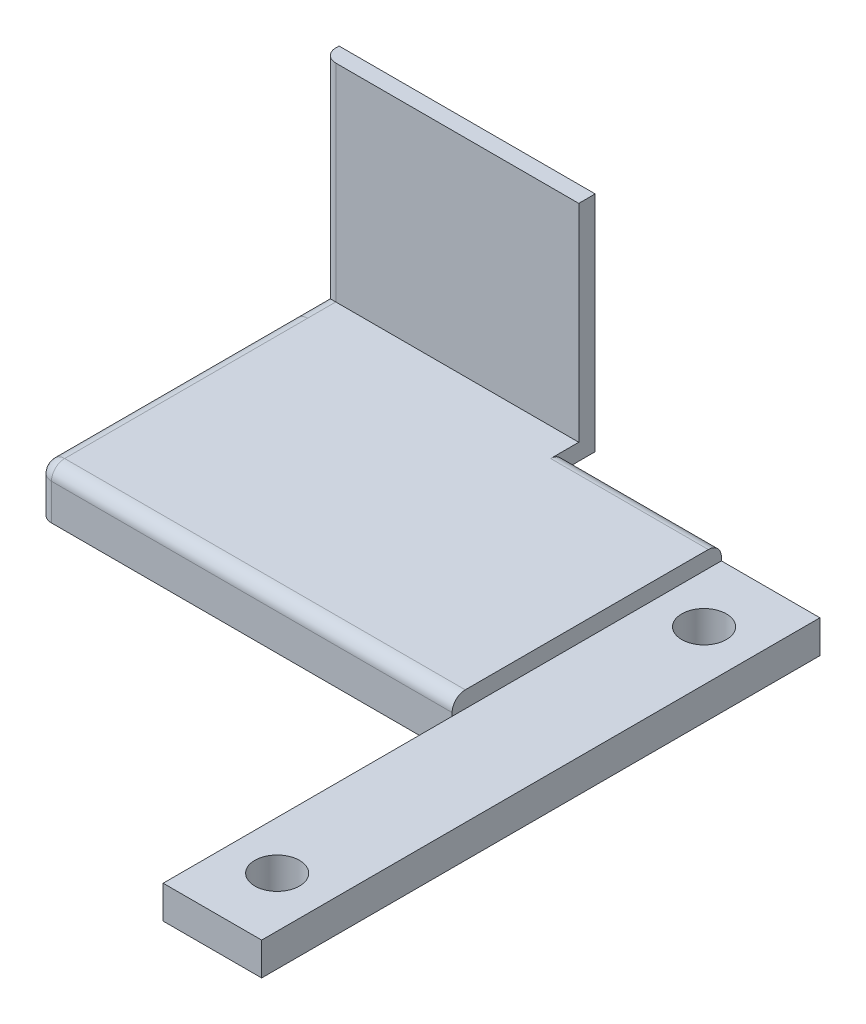
ISO-10303-21;
HEADER;
FILE_DESCRIPTION(('STEP AP214'),'2;1');
FILE_NAME('part.step','',(''),(''),'','','');
FILE_SCHEMA(('AUTOMOTIVE_DESIGN { 1 0 10303 214 1 1 1 1 }'));
ENDSEC;
DATA;
#1=APPLICATION_CONTEXT('core data for automotive mechanical design processes');
#2=APPLICATION_PROTOCOL_DEFINITION('international standard','automotive_design',2000,#1);
#3=PRODUCT_CONTEXT('',#1,'mechanical');
#4=PRODUCT('Part','Part','',(#3));
#5=PRODUCT_RELATED_PRODUCT_CATEGORY('part','',(#4));
#6=PRODUCT_DEFINITION_FORMATION('','',#4);
#7=PRODUCT_DEFINITION_CONTEXT('part definition',#1,'design');
#8=PRODUCT_DEFINITION('design','',#6,#7);
#9=PRODUCT_DEFINITION_SHAPE('','',#8);
#10=(LENGTH_UNIT() NAMED_UNIT(*) SI_UNIT(.MILLI.,.METRE.));
#11=(NAMED_UNIT(*) PLANE_ANGLE_UNIT() SI_UNIT($,.RADIAN.));
#12=(NAMED_UNIT(*) SI_UNIT($,.STERADIAN.) SOLID_ANGLE_UNIT());
#13=UNCERTAINTY_MEASURE_WITH_UNIT(LENGTH_MEASURE(1.E-05),#10,'distance_accuracy_value','');
#14=(GEOMETRIC_REPRESENTATION_CONTEXT(3) GLOBAL_UNCERTAINTY_ASSIGNED_CONTEXT((#13)) GLOBAL_UNIT_ASSIGNED_CONTEXT((#10,
#11,#12)) REPRESENTATION_CONTEXT('',''));
#15=CARTESIAN_POINT('',(0.,0.,0.));
#16=DIRECTION('',(0.,0.,1.));
#17=DIRECTION('',(1.,0.,0.));
#18=AXIS2_PLACEMENT_3D('',#15,#16,#17);
#19=CARTESIAN_POINT('',(0.,5.,0.));
#20=DIRECTION('',(0.,0.,1.));
#21=DIRECTION('',(1.,0.,0.));
#22=AXIS2_PLACEMENT_3D('',#19,#20,#21);
#23=PLANE('',#22);
#24=DIRECTION('',(-1.,0.,0.));
#25=VECTOR('',#24,1.);
#26=CARTESIAN_POINT('',(0.,5.,0.));
#27=LINE('',#26,#25);
#28=CARTESIAN_POINT('',(1.,5.,0.));
#29=VERTEX_POINT('',#28);
#30=CARTESIAN_POINT('',(-36.,5.,0.));
#31=VERTEX_POINT('',#30);
#32=EDGE_CURVE('E213',#29,#31,#27,.T.);
#33=ORIENTED_EDGE('',*,*,#32,.F.);
#34=DIRECTION('',(0.,-1.,0.));
#35=VECTOR('',#34,1.);
#36=CARTESIAN_POINT('',(1.,5.,0.));
#37=LINE('',#36,#35);
#38=CARTESIAN_POINT('',(1.,5.5,0.));
#39=VERTEX_POINT('',#38);
#40=EDGE_CURVE('E207',#39,#29,#37,.T.);
#41=ORIENTED_EDGE('',*,*,#40,.F.);
#42=DIRECTION('',(-1.,0.,0.));
#43=VECTOR('',#42,1.);
#44=CARTESIAN_POINT('',(0.,5.5,0.));
#45=LINE('',#44,#43);
#46=CARTESIAN_POINT('',(25.,5.5,0.));
#47=VERTEX_POINT('',#46);
#48=EDGE_CURVE('E279',#39,#47,#45,.F.);
#49=ORIENTED_EDGE('',*,*,#48,.T.);
#50=DIRECTION('',(0.,-1.,0.));
#51=VECTOR('',#50,1.);
#52=CARTESIAN_POINT('',(25.,7.5,0.));
#53=LINE('',#52,#51);
#54=CARTESIAN_POINT('',(25.,5.,0.));
#55=VERTEX_POINT('',#54);
#56=EDGE_CURVE('E245',#47,#55,#53,.T.);
#57=ORIENTED_EDGE('',*,*,#56,.T.);
#58=DIRECTION('',(-1.,0.,0.));
#59=VECTOR('',#58,1.);
#60=CARTESIAN_POINT('',(0.,5.,0.));
#61=LINE('',#60,#59);
#62=CARTESIAN_POINT('',(40.,5.,0.));
#63=VERTEX_POINT('',#62);
#64=EDGE_CURVE('E256',#63,#55,#61,.T.);
#65=ORIENTED_EDGE('',*,*,#64,.F.);
#66=DIRECTION('',(0.,-1.,0.));
#67=VECTOR('',#66,1.);
#68=CARTESIAN_POINT('',(40.,5.,0.));
#69=LINE('',#68,#67);
#70=CARTESIAN_POINT('',(40.,0.,0.));
#71=VERTEX_POINT('',#70);
#72=EDGE_CURVE('E259',#63,#71,#69,.T.);
#73=ORIENTED_EDGE('',*,*,#72,.T.);
#74=DIRECTION('',(-1.,0.,0.));
#75=VECTOR('',#74,1.);
#76=CARTESIAN_POINT('',(0.,0.,0.));
#77=LINE('',#76,#75);
#78=CARTESIAN_POINT('',(-36.,0.,0.));
#79=VERTEX_POINT('',#78);
#80=EDGE_CURVE('E254',#71,#79,#77,.T.);
#81=ORIENTED_EDGE('',*,*,#80,.T.);
#82=DIRECTION('',(0.,-1.,0.));
#83=VECTOR('',#82,1.);
#84=CARTESIAN_POINT('',(-36.,5.50000000000001,0.));
#85=LINE('',#84,#83);
#86=EDGE_CURVE('E276',#79,#31,#85,.F.);
#87=ORIENTED_EDGE('',*,*,#86,.T.);
#88=EDGE_LOOP('',(#33,#41,#49,#57,#65,#73,#81,#87));
#89=FACE_BOUND('',#88,.T.);
#90=ADVANCED_FACE('F45',(#89),#23,.F.);
#91=CARTESIAN_POINT('',(-36.,100.607464792035,2.));
#92=DIRECTION('',(0.,1.,0.));
#93=DIRECTION('',(0.,0.,1.));
#94=AXIS2_PLACEMENT_3D('',#91,#92,#93);
#95=CYLINDRICAL_SURFACE('',#94,2.);
#96=DIRECTION('',(0.,-1.,0.));
#97=VECTOR('',#96,1.);
#98=CARTESIAN_POINT('',(-38.,0.,2.));
#99=LINE('',#98,#97);
#100=CARTESIAN_POINT('',(-38.,5.,2.));
#101=VERTEX_POINT('',#100);
#102=CARTESIAN_POINT('',(-38.,0.,2.));
#103=VERTEX_POINT('',#102);
#104=EDGE_CURVE('E287',#101,#103,#99,.T.);
#105=ORIENTED_EDGE('',*,*,#104,.F.);
#106=CARTESIAN_POINT('',(-36.,5.,2.));
#107=DIRECTION('',(0.,1.,0.));
#108=DIRECTION('',(0.,0.,1.));
#109=AXIS2_PLACEMENT_3D('',#106,#107,#108);
#110=CIRCLE('',#109,2.);
#111=EDGE_CURVE('E312',#101,#31,#110,.F.);
#112=ORIENTED_EDGE('',*,*,#111,.T.);
#113=ORIENTED_EDGE('',*,*,#86,.F.);
#114=CARTESIAN_POINT('',(-36.,0.,2.));
#115=DIRECTION('',(0.,1.,0.));
#116=DIRECTION('',(0.,0.,1.));
#117=AXIS2_PLACEMENT_3D('',#114,#115,#116);
#118=CIRCLE('',#117,2.);
#119=EDGE_CURVE('E289',#103,#79,#118,.F.);
#120=ORIENTED_EDGE('',*,*,#119,.F.);
#121=EDGE_LOOP('',(#105,#112,#113,#120));
#122=FACE_BOUND('',#121,.T.);
#123=ADVANCED_FACE('F342',(#122),#95,.T.);
#124=CARTESIAN_POINT('',(0.,5.5,2.));
#125=DIRECTION('',(-1.,0.,0.));
#126=DIRECTION('',(0.,0.,1.));
#127=AXIS2_PLACEMENT_3D('',#124,#125,#126);
#128=CYLINDRICAL_SURFACE('',#127,2.);
#129=ORIENTED_EDGE('',*,*,#48,.F.);
#130=CARTESIAN_POINT('',(1.,5.5,2.));
#131=DIRECTION('',(-1.,0.,0.));
#132=DIRECTION('',(0.,0.,1.));
#133=AXIS2_PLACEMENT_3D('',#130,#131,#132);
#134=CIRCLE('',#133,2.);
#135=CARTESIAN_POINT('',(1.,7.5,2.));
#136=VERTEX_POINT('',#135);
#137=EDGE_CURVE('E306',#39,#136,#134,.F.);
#138=ORIENTED_EDGE('',*,*,#137,.T.);
#139=DIRECTION('',(-1.,0.,0.));
#140=VECTOR('',#139,1.);
#141=CARTESIAN_POINT('',(0.,7.5,2.));
#142=LINE('',#141,#140);
#143=CARTESIAN_POINT('',(25.,7.5,2.));
#144=VERTEX_POINT('',#143);
#145=EDGE_CURVE('E191',#144,#136,#142,.T.);
#146=ORIENTED_EDGE('',*,*,#145,.F.);
#147=CARTESIAN_POINT('',(25.,5.5,2.));
#148=DIRECTION('',(-1.,0.,0.));
#149=DIRECTION('',(0.,0.,1.));
#150=AXIS2_PLACEMENT_3D('',#147,#148,#149);
#151=CIRCLE('',#150,2.);
#152=EDGE_CURVE('E281',#47,#144,#151,.F.);
#153=ORIENTED_EDGE('',*,*,#152,.F.);
#154=EDGE_LOOP('',(#129,#138,#146,#153));
#155=FACE_BOUND('',#154,.T.);
#156=ADVANCED_FACE('F380',(#155),#128,.T.);
#157=CARTESIAN_POINT('',(0.,5.,85.));
#158=DIRECTION('',(0.,0.,-1.));
#159=DIRECTION('',(-1.,0.,0.));
#160=AXIS2_PLACEMENT_3D('',#157,#158,#159);
#161=PLANE('',#160);
#162=DIRECTION('',(1.,0.,0.));
#163=VECTOR('',#162,1.);
#164=CARTESIAN_POINT('',(0.,5.,85.));
#165=LINE('',#164,#163);
#166=CARTESIAN_POINT('',(25.,5.,85.));
#167=VERTEX_POINT('',#166);
#168=CARTESIAN_POINT('',(40.,5.,85.));
#169=VERTEX_POINT('',#168);
#170=EDGE_CURVE('E251',#167,#169,#165,.T.);
#171=ORIENTED_EDGE('',*,*,#170,.F.);
#172=DIRECTION('',(0.,1.,0.));
#173=VECTOR('',#172,1.);
#174=CARTESIAN_POINT('',(25.,0.,85.));
#175=LINE('',#174,#173);
#176=CARTESIAN_POINT('',(25.,0.,85.));
#177=VERTEX_POINT('',#176);
#178=EDGE_CURVE('E219',#177,#167,#175,.T.);
#179=ORIENTED_EDGE('',*,*,#178,.F.);
#180=DIRECTION('',(1.,0.,0.));
#181=VECTOR('',#180,1.);
#182=CARTESIAN_POINT('',(0.,0.,85.));
#183=LINE('',#182,#181);
#184=CARTESIAN_POINT('',(40.,0.,85.));
#185=VERTEX_POINT('',#184);
#186=EDGE_CURVE('E250',#177,#185,#183,.T.);
#187=ORIENTED_EDGE('',*,*,#186,.T.);
#188=DIRECTION('',(0.,-1.,0.));
#189=VECTOR('',#188,1.);
#190=CARTESIAN_POINT('',(40.,5.,85.));
#191=LINE('',#190,#189);
#192=EDGE_CURVE('E267',#169,#185,#191,.T.);
#193=ORIENTED_EDGE('',*,*,#192,.F.);
#194=EDGE_LOOP('',(#171,#179,#187,#193));
#195=FACE_BOUND('',#194,.T.);
#196=ADVANCED_FACE('F362',(#195),#161,.F.);
#197=CARTESIAN_POINT('',(40.,5.,0.));
#198=DIRECTION('',(-1.,0.,0.));
#199=DIRECTION('',(0.,0.,1.));
#200=AXIS2_PLACEMENT_3D('',#197,#198,#199);
#201=PLANE('',#200);
#202=DIRECTION('',(0.,0.,-1.));
#203=VECTOR('',#202,1.);
#204=CARTESIAN_POINT('',(40.,0.,0.));
#205=LINE('',#204,#203);
#206=EDGE_CURVE('E261',#185,#71,#205,.T.);
#207=ORIENTED_EDGE('',*,*,#206,.T.);
#208=ORIENTED_EDGE('',*,*,#72,.F.);
#209=DIRECTION('',(0.,0.,-1.));
#210=VECTOR('',#209,1.);
#211=CARTESIAN_POINT('',(40.,5.,0.));
#212=LINE('',#211,#210);
#213=EDGE_CURVE('E253',#169,#63,#212,.T.);
#214=ORIENTED_EDGE('',*,*,#213,.F.);
#215=ORIENTED_EDGE('',*,*,#192,.T.);
#216=EDGE_LOOP('',(#207,#208,#214,#215));
#217=FACE_BOUND('',#216,.T.);
#218=ADVANCED_FACE('F355',(#217),#201,.F.);
#219=CARTESIAN_POINT('',(0.,5.,0.));
#220=DIRECTION('',(0.,1.,0.));
#221=DIRECTION('',(0.,0.,1.));
#222=AXIS2_PLACEMENT_3D('',#219,#220,#221);
#223=PLANE('',#222);
#224=CARTESIAN_POINT('',(32.3610909490937,5.,10.));
#225=DIRECTION('',(0.,1.,0.));
#226=DIRECTION('',(0.,0.,1.));
#227=AXIS2_PLACEMENT_3D('',#224,#225,#226);
#228=CIRCLE('',#227,3.4);
#229=CARTESIAN_POINT('',(32.3610909490937,5.,13.4));
#230=VERTEX_POINT('',#229);
#231=EDGE_CURVE('E227',#230,#230,#228,.T.);
#232=ORIENTED_EDGE('',*,*,#231,.F.);
#233=EDGE_LOOP('',(#232));
#234=FACE_BOUND('',#233,.T.);
#235=CARTESIAN_POINT('',(32.3610909490937,5.,75.));
#236=DIRECTION('',(0.,1.,0.));
#237=DIRECTION('',(0.,0.,1.));
#238=AXIS2_PLACEMENT_3D('',#235,#236,#237);
#239=CIRCLE('',#238,3.4);
#240=CARTESIAN_POINT('',(32.3610909490937,5.,78.4));
#241=VERTEX_POINT('',#240);
#242=EDGE_CURVE('E231',#241,#241,#239,.T.);
#243=ORIENTED_EDGE('',*,*,#242,.F.);
#244=EDGE_LOOP('',(#243));
#245=FACE_BOUND('',#244,.T.);
#246=DIRECTION('',(0.,0.,-1.));
#247=VECTOR('',#246,1.);
#248=CARTESIAN_POINT('',(25.,5.,85.));
#249=LINE('',#248,#247);
#250=CARTESIAN_POINT('',(25.,5.,41.));
#251=VERTEX_POINT('',#250);
#252=EDGE_CURVE('E246',#167,#251,#249,.T.);
#253=ORIENTED_EDGE('',*,*,#252,.F.);
#254=ORIENTED_EDGE('',*,*,#170,.T.);
#255=ORIENTED_EDGE('',*,*,#213,.T.);
#256=ORIENTED_EDGE('',*,*,#64,.T.);
#257=EDGE_CURVE('E242',#251,#55,#249,.T.);
#258=ORIENTED_EDGE('',*,*,#257,.F.);
#259=EDGE_LOOP('',(#253,#254,#255,#256,#258));
#260=FACE_BOUND('',#259,.T.);
#261=ADVANCED_FACE('F369',(#234,#245,#260),#223,.T.);
#262=CARTESIAN_POINT('',(0.,0.,0.));
#263=DIRECTION('',(0.,1.,0.));
#264=DIRECTION('',(0.,0.,1.));
#265=AXIS2_PLACEMENT_3D('',#262,#263,#264);
#266=PLANE('',#265);
#267=CARTESIAN_POINT('',(32.3610909490937,0.,10.));
#268=DIRECTION('',(0.,1.,0.));
#269=DIRECTION('',(0.,0.,1.));
#270=AXIS2_PLACEMENT_3D('',#267,#268,#269);
#271=CIRCLE('',#270,3.4);
#272=CARTESIAN_POINT('',(32.3610909490937,0.,13.4));
#273=VERTEX_POINT('',#272);
#274=EDGE_CURVE('E228',#273,#273,#271,.T.);
#275=ORIENTED_EDGE('',*,*,#274,.T.);
#276=EDGE_LOOP('',(#275));
#277=FACE_BOUND('',#276,.T.);
#278=CARTESIAN_POINT('',(32.3610909490937,0.,75.));
#279=DIRECTION('',(0.,1.,0.));
#280=DIRECTION('',(0.,0.,1.));
#281=AXIS2_PLACEMENT_3D('',#278,#279,#280);
#282=CIRCLE('',#281,3.4);
#283=CARTESIAN_POINT('',(32.3610909490937,0.,78.4));
#284=VERTEX_POINT('',#283);
#285=EDGE_CURVE('E234',#284,#284,#282,.T.);
#286=ORIENTED_EDGE('',*,*,#285,.T.);
#287=EDGE_LOOP('',(#286));
#288=FACE_BOUND('',#287,.T.);
#289=DIRECTION('',(1.,0.,0.));
#290=VECTOR('',#289,1.);
#291=CARTESIAN_POINT('',(-38.,0.,41.));
#292=LINE('',#291,#290);
#293=CARTESIAN_POINT('',(-36.,0.,41.));
#294=VERTEX_POINT('',#293);
#295=CARTESIAN_POINT('',(25.,0.,41.));
#296=VERTEX_POINT('',#295);
#297=EDGE_CURVE('E216',#294,#296,#292,.T.);
#298=ORIENTED_EDGE('',*,*,#297,.F.);
#299=CARTESIAN_POINT('',(-36.,0.,39.));
#300=DIRECTION('',(0.,1.,0.));
#301=DIRECTION('',(0.,0.,1.));
#302=AXIS2_PLACEMENT_3D('',#299,#300,#301);
#303=CIRCLE('',#302,2.);
#304=CARTESIAN_POINT('',(-38.,0.,39.));
#305=VERTEX_POINT('',#304);
#306=EDGE_CURVE('E296',#294,#305,#303,.F.);
#307=ORIENTED_EDGE('',*,*,#306,.T.);
#308=DIRECTION('',(0.,0.,-1.));
#309=VECTOR('',#308,1.);
#310=CARTESIAN_POINT('',(-38.,0.,0.));
#311=LINE('',#310,#309);
#312=EDGE_CURVE('E237',#305,#103,#311,.T.);
#313=ORIENTED_EDGE('',*,*,#312,.T.);
#314=ORIENTED_EDGE('',*,*,#119,.T.);
#315=ORIENTED_EDGE('',*,*,#80,.F.);
#316=ORIENTED_EDGE('',*,*,#206,.F.);
#317=ORIENTED_EDGE('',*,*,#186,.F.);
#318=DIRECTION('',(0.,0.,1.));
#319=VECTOR('',#318,1.);
#320=CARTESIAN_POINT('',(25.,0.,41.));
#321=LINE('',#320,#319);
#322=EDGE_CURVE('E223',#296,#177,#321,.T.);
#323=ORIENTED_EDGE('',*,*,#322,.F.);
#324=EDGE_LOOP('',(#298,#307,#313,#314,#315,#316,#317,#323));
#325=FACE_BOUND('',#324,.T.);
#326=ADVANCED_FACE('F347',(#277,#288,#325),#266,.F.);
#327=CARTESIAN_POINT('',(25.,7.5,85.));
#328=DIRECTION('',(-1.,0.,0.));
#329=DIRECTION('',(0.,0.,1.));
#330=AXIS2_PLACEMENT_3D('',#327,#328,#329);
#331=PLANE('',#330);
#332=DIRECTION('',(0.,0.,-1.));
#333=VECTOR('',#332,1.);
#334=CARTESIAN_POINT('',(25.,7.5,85.));
#335=LINE('',#334,#333);
#336=CARTESIAN_POINT('',(25.,7.5,39.));
#337=VERTEX_POINT('',#336);
#338=EDGE_CURVE('E243',#337,#144,#335,.T.);
#339=ORIENTED_EDGE('',*,*,#338,.F.);
#340=CARTESIAN_POINT('',(25.,5.5,39.));
#341=DIRECTION('',(-1.,0.,0.));
#342=DIRECTION('',(0.,0.,1.));
#343=AXIS2_PLACEMENT_3D('',#340,#341,#342);
#344=CIRCLE('',#343,2.);
#345=CARTESIAN_POINT('',(25.,5.5,41.));
#346=VERTEX_POINT('',#345);
#347=EDGE_CURVE('E304',#337,#346,#344,.F.);
#348=ORIENTED_EDGE('',*,*,#347,.T.);
#349=DIRECTION('',(0.,1.,0.));
#350=VECTOR('',#349,1.);
#351=CARTESIAN_POINT('',(25.,0.,41.));
#352=LINE('',#351,#350);
#353=EDGE_CURVE('E218',#251,#346,#352,.T.);
#354=ORIENTED_EDGE('',*,*,#353,.F.);
#355=ORIENTED_EDGE('',*,*,#257,.T.);
#356=ORIENTED_EDGE('',*,*,#56,.F.);
#357=ORIENTED_EDGE('',*,*,#152,.T.);
#358=EDGE_LOOP('',(#339,#348,#354,#355,#356,#357));
#359=FACE_BOUND('',#358,.T.);
#360=ADVANCED_FACE('F374',(#359),#331,.F.);
#361=CARTESIAN_POINT('',(0.,7.5,0.));
#362=DIRECTION('',(0.,-1.,0.));
#363=DIRECTION('',(0.,0.,-1.));
#364=AXIS2_PLACEMENT_3D('',#361,#362,#363);
#365=PLANE('',#364);
#366=DIRECTION('',(-1.,0.,0.));
#367=VECTOR('',#366,1.);
#368=CARTESIAN_POINT('',(1.,7.5,-2.28413926292213));
#369=LINE('',#368,#367);
#370=CARTESIAN_POINT('',(1.,7.5,-2.28413926292213));
#371=VERTEX_POINT('',#370);
#372=CARTESIAN_POINT('',(-36.,7.5,-2.28413926292213));
#373=VERTEX_POINT('',#372);
#374=EDGE_CURVE('E171',#371,#373,#369,.T.);
#375=ORIENTED_EDGE('',*,*,#374,.T.);
#376=DIRECTION('',(0.,0.,-1.));
#377=VECTOR('',#376,1.);
#378=CARTESIAN_POINT('',(-36.,7.5,2.));
#379=LINE('',#378,#377);
#380=CARTESIAN_POINT('',(-36.,7.5,2.));
#381=VERTEX_POINT('',#380);
#382=EDGE_CURVE('E11',#373,#381,#379,.F.);
#383=ORIENTED_EDGE('',*,*,#382,.T.);
#384=DIRECTION('',(0.,0.,1.));
#385=VECTOR('',#384,1.);
#386=CARTESIAN_POINT('',(-36.,7.5,85.));
#387=LINE('',#386,#385);
#388=CARTESIAN_POINT('',(-36.,7.5,39.));
#389=VERTEX_POINT('',#388);
#390=EDGE_CURVE('E270',#381,#389,#387,.T.);
#391=ORIENTED_EDGE('',*,*,#390,.T.);
#392=DIRECTION('',(1.,0.,0.));
#393=VECTOR('',#392,1.);
#394=CARTESIAN_POINT('',(0.,7.5,39.));
#395=LINE('',#394,#393);
#396=EDGE_CURVE('E302',#389,#337,#395,.T.);
#397=ORIENTED_EDGE('',*,*,#396,.T.);
#398=ORIENTED_EDGE('',*,*,#338,.T.);
#399=ORIENTED_EDGE('',*,*,#145,.T.);
#400=DIRECTION('',(0.,0.,-1.));
#401=VECTOR('',#400,1.);
#402=CARTESIAN_POINT('',(1.,7.5,0.));
#403=LINE('',#402,#401);
#404=EDGE_CURVE('E183',#136,#371,#403,.T.);
#405=ORIENTED_EDGE('',*,*,#404,.T.);
#406=EDGE_LOOP('',(#375,#383,#391,#397,#398,#399,#405));
#407=FACE_BOUND('',#406,.T.);
#408=ADVANCED_FACE('F189',(#407),#365,.F.);
#409=CARTESIAN_POINT('',(-38.,100.607464792035,0.));
#410=DIRECTION('',(-1.,0.,0.));
#411=DIRECTION('',(0.,0.,1.));
#412=AXIS2_PLACEMENT_3D('',#409,#410,#411);
#413=PLANE('',#412);
#414=DIRECTION('',(0.,0.,-1.));
#415=VECTOR('',#414,1.);
#416=CARTESIAN_POINT('',(-38.,5.50000000000001,-2.28413926292213));
#417=LINE('',#416,#415);
#418=CARTESIAN_POINT('',(-38.,5.5,2.));
#419=VERTEX_POINT('',#418);
#420=CARTESIAN_POINT('',(-38.,5.50000000000001,-4.28413926292213));
#421=VERTEX_POINT('',#420);
#422=EDGE_CURVE('E315',#419,#421,#417,.T.);
#423=ORIENTED_EDGE('',*,*,#422,.T.);
#424=DIRECTION('',(0.,1.,0.));
#425=VECTOR('',#424,1.);
#426=CARTESIAN_POINT('',(-38.,100.607464792035,-4.28413926292213));
#427=LINE('',#426,#425);
#428=CARTESIAN_POINT('',(-38.,39.,-4.28413926292213));
#429=VERTEX_POINT('',#428);
#430=EDGE_CURVE('E317',#421,#429,#427,.T.);
#431=ORIENTED_EDGE('',*,*,#430,.T.);
#432=DIRECTION('',(0.,0.,1.));
#433=VECTOR('',#432,1.);
#434=CARTESIAN_POINT('',(-38.,39.,0.));
#435=LINE('',#434,#433);
#436=CARTESIAN_POINT('',(-38.,39.,-4.78413926292213));
#437=VERTEX_POINT('',#436);
#438=EDGE_CURVE('E201',#437,#429,#435,.T.);
#439=ORIENTED_EDGE('',*,*,#438,.F.);
#440=DIRECTION('',(0.,1.,0.));
#441=VECTOR('',#440,1.);
#442=CARTESIAN_POINT('',(-38.,0.,-4.78413926292213));
#443=LINE('',#442,#441);
#444=CARTESIAN_POINT('',(-38.,5.,-4.78413926292213));
#445=VERTEX_POINT('',#444);
#446=EDGE_CURVE('E194',#445,#437,#443,.T.);
#447=ORIENTED_EDGE('',*,*,#446,.F.);
#448=DIRECTION('',(0.,0.,-1.));
#449=VECTOR('',#448,1.);
#450=CARTESIAN_POINT('',(-38.,5.,0.));
#451=LINE('',#450,#449);
#452=EDGE_CURVE('E192',#101,#445,#451,.T.);
#453=ORIENTED_EDGE('',*,*,#452,.F.);
#454=ORIENTED_EDGE('',*,*,#104,.T.);
#455=ORIENTED_EDGE('',*,*,#312,.F.);
#456=DIRECTION('',(0.,-1.,0.));
#457=VECTOR('',#456,1.);
#458=CARTESIAN_POINT('',(-38.,5.5,39.));
#459=LINE('',#458,#457);
#460=CARTESIAN_POINT('',(-38.,5.5,39.));
#461=VERTEX_POINT('',#460);
#462=EDGE_CURVE('E298',#305,#461,#459,.F.);
#463=ORIENTED_EDGE('',*,*,#462,.T.);
#464=DIRECTION('',(0.,0.,1.));
#465=VECTOR('',#464,1.);
#466=CARTESIAN_POINT('',(-38.,5.5,0.));
#467=LINE('',#466,#465);
#468=EDGE_CURVE('E273',#461,#419,#467,.F.);
#469=ORIENTED_EDGE('',*,*,#468,.T.);
#470=EDGE_LOOP('',(#423,#431,#439,#447,#453,#454,#455,#463,#469));
#471=FACE_BOUND('',#470,.T.);
#472=ADVANCED_FACE('F324',(#471),#413,.T.);
#473=CARTESIAN_POINT('',(32.3610909490937,0.,75.));
#474=DIRECTION('',(0.,1.,0.));
#475=DIRECTION('',(0.,0.,1.));
#476=AXIS2_PLACEMENT_3D('',#473,#474,#475);
#477=CYLINDRICAL_SURFACE('',#476,3.4);
#478=ORIENTED_EDGE('',*,*,#285,.F.);
#479=EDGE_LOOP('',(#478));
#480=FACE_BOUND('',#479,.T.);
#481=ORIENTED_EDGE('',*,*,#242,.T.);
#482=EDGE_LOOP('',(#481));
#483=FACE_BOUND('',#482,.T.);
#484=ADVANCED_FACE('F446',(#480,#483),#477,.F.);
#485=CARTESIAN_POINT('',(32.3610909490937,0.,10.));
#486=DIRECTION('',(0.,1.,0.));
#487=DIRECTION('',(0.,0.,1.));
#488=AXIS2_PLACEMENT_3D('',#485,#486,#487);
#489=CYLINDRICAL_SURFACE('',#488,3.4);
#490=ORIENTED_EDGE('',*,*,#274,.F.);
#491=EDGE_LOOP('',(#490));
#492=FACE_BOUND('',#491,.T.);
#493=ORIENTED_EDGE('',*,*,#231,.T.);
#494=EDGE_LOOP('',(#493));
#495=FACE_BOUND('',#494,.T.);
#496=ADVANCED_FACE('F425',(#492,#495),#489,.F.);
#497=CARTESIAN_POINT('',(-36.,5.5,0.));
#498=DIRECTION('',(0.,0.,-1.));
#499=DIRECTION('',(-1.,0.,0.));
#500=AXIS2_PLACEMENT_3D('',#497,#498,#499);
#501=CYLINDRICAL_SURFACE('',#500,2.);
#502=ORIENTED_EDGE('',*,*,#468,.F.);
#503=CARTESIAN_POINT('',(-36.,5.5,39.));
#504=DIRECTION('',(0.,0.,-1.));
#505=DIRECTION('',(-1.,0.,0.));
#506=AXIS2_PLACEMENT_3D('',#503,#504,#505);
#507=CIRCLE('',#506,2.);
#508=EDGE_CURVE('E300',#461,#389,#507,.T.);
#509=ORIENTED_EDGE('',*,*,#508,.T.);
#510=ORIENTED_EDGE('',*,*,#390,.F.);
#511=CARTESIAN_POINT('',(-36.,5.5,2.));
#512=DIRECTION('',(0.,0.,-1.));
#513=DIRECTION('',(-1.,0.,0.));
#514=AXIS2_PLACEMENT_3D('',#511,#512,#513);
#515=CIRCLE('',#514,2.);
#516=EDGE_CURVE('E284',#381,#419,#515,.F.);
#517=ORIENTED_EDGE('',*,*,#516,.T.);
#518=EDGE_LOOP('',(#502,#509,#510,#517));
#519=FACE_BOUND('',#518,.T.);
#520=ADVANCED_FACE('F400',(#519),#501,.T.);
#521=CARTESIAN_POINT('',(0.,0.,41.));
#522=DIRECTION('',(0.,0.,-1.));
#523=DIRECTION('',(-1.,0.,0.));
#524=AXIS2_PLACEMENT_3D('',#521,#522,#523);
#525=PLANE('',#524);
#526=DIRECTION('',(1.,0.,0.));
#527=VECTOR('',#526,1.);
#528=CARTESIAN_POINT('',(0.,5.5,41.));
#529=LINE('',#528,#527);
#530=CARTESIAN_POINT('',(-36.,5.5,41.));
#531=VERTEX_POINT('',#530);
#532=EDGE_CURVE('E291',#346,#531,#529,.F.);
#533=ORIENTED_EDGE('',*,*,#532,.T.);
#534=DIRECTION('',(0.,-1.,0.));
#535=VECTOR('',#534,1.);
#536=CARTESIAN_POINT('',(-36.,0.,41.));
#537=LINE('',#536,#535);
#538=EDGE_CURVE('E293',#531,#294,#537,.T.);
#539=ORIENTED_EDGE('',*,*,#538,.T.);
#540=ORIENTED_EDGE('',*,*,#297,.T.);
#541=EDGE_CURVE('E220',#296,#251,#352,.T.);
#542=ORIENTED_EDGE('',*,*,#541,.T.);
#543=ORIENTED_EDGE('',*,*,#353,.T.);
#544=EDGE_LOOP('',(#533,#539,#540,#542,#543));
#545=FACE_BOUND('',#544,.T.);
#546=ADVANCED_FACE('F389',(#545),#525,.F.);
#547=CARTESIAN_POINT('',(25.,0.,41.));
#548=DIRECTION('',(1.,0.,0.));
#549=DIRECTION('',(0.,0.,-1.));
#550=AXIS2_PLACEMENT_3D('',#547,#548,#549);
#551=PLANE('',#550);
#552=ORIENTED_EDGE('',*,*,#252,.T.);
#553=ORIENTED_EDGE('',*,*,#541,.F.);
#554=ORIENTED_EDGE('',*,*,#322,.T.);
#555=ORIENTED_EDGE('',*,*,#178,.T.);
#556=EDGE_LOOP('',(#552,#553,#554,#555));
#557=FACE_BOUND('',#556,.T.);
#558=ADVANCED_FACE('F365',(#557),#551,.F.);
#559=CARTESIAN_POINT('',(0.,5.5,39.));
#560=DIRECTION('',(1.,0.,0.));
#561=DIRECTION('',(0.,0.,-1.));
#562=AXIS2_PLACEMENT_3D('',#559,#560,#561);
#563=CYLINDRICAL_SURFACE('',#562,2.);
#564=ORIENTED_EDGE('',*,*,#347,.F.);
#565=ORIENTED_EDGE('',*,*,#396,.F.);
#566=CARTESIAN_POINT('',(-36.,5.5,39.));
#567=DIRECTION('',(-1.,0.,0.));
#568=DIRECTION('',(0.,0.,1.));
#569=AXIS2_PLACEMENT_3D('',#566,#567,#568);
#570=CIRCLE('',#569,2.);
#571=EDGE_CURVE('E225',#531,#389,#570,.T.);
#572=ORIENTED_EDGE('',*,*,#571,.F.);
#573=ORIENTED_EDGE('',*,*,#532,.F.);
#574=EDGE_LOOP('',(#564,#565,#572,#573));
#575=FACE_BOUND('',#574,.T.);
#576=ADVANCED_FACE('F385',(#575),#563,.T.);
#577=CARTESIAN_POINT('',(-36.,5.5,39.));
#578=DIRECTION('',(0.,0.,-1.));
#579=DIRECTION('',(-1.,0.,0.));
#580=AXIS2_PLACEMENT_3D('',#577,#578,#579);
#581=SPHERICAL_SURFACE('',#580,2.);
#582=ORIENTED_EDGE('',*,*,#571,.T.);
#583=ORIENTED_EDGE('',*,*,#508,.F.);
#584=CARTESIAN_POINT('',(-36.,5.5,39.));
#585=DIRECTION('',(0.,-1.,0.));
#586=DIRECTION('',(0.,0.,-1.));
#587=AXIS2_PLACEMENT_3D('',#584,#585,#586);
#588=CIRCLE('',#587,2.);
#589=EDGE_CURVE('E215',#531,#461,#588,.T.);
#590=ORIENTED_EDGE('',*,*,#589,.F.);
#591=EDGE_LOOP('',(#582,#583,#590));
#592=FACE_BOUND('',#591,.T.);
#593=ADVANCED_FACE('F397',(#592),#581,.T.);
#594=CARTESIAN_POINT('',(-36.,0.,39.));
#595=DIRECTION('',(0.,1.,0.));
#596=DIRECTION('',(0.,0.,1.));
#597=AXIS2_PLACEMENT_3D('',#594,#595,#596);
#598=CYLINDRICAL_SURFACE('',#597,2.);
#599=ORIENTED_EDGE('',*,*,#589,.T.);
#600=ORIENTED_EDGE('',*,*,#462,.F.);
#601=ORIENTED_EDGE('',*,*,#306,.F.);
#602=ORIENTED_EDGE('',*,*,#538,.F.);
#603=EDGE_LOOP('',(#599,#600,#601,#602));
#604=FACE_BOUND('',#603,.T.);
#605=ADVANCED_FACE('F394',(#604),#598,.T.);
#606=CARTESIAN_POINT('',(1.,5.,0.));
#607=DIRECTION('',(0.,1.,0.));
#608=DIRECTION('',(0.,0.,1.));
#609=AXIS2_PLACEMENT_3D('',#606,#607,#608);
#610=PLANE('',#609);
#611=DIRECTION('',(0.,0.,-1.));
#612=VECTOR('',#611,1.);
#613=CARTESIAN_POINT('',(1.,5.,0.));
#614=LINE('',#613,#612);
#615=CARTESIAN_POINT('',(1.,5.,-4.78413926292213));
#616=VERTEX_POINT('',#615);
#617=EDGE_CURVE('E179',#29,#616,#614,.T.);
#618=ORIENTED_EDGE('',*,*,#617,.F.);
#619=ORIENTED_EDGE('',*,*,#32,.T.);
#620=ORIENTED_EDGE('',*,*,#111,.F.);
#621=ORIENTED_EDGE('',*,*,#452,.T.);
#622=DIRECTION('',(-1.,0.,0.));
#623=VECTOR('',#622,1.);
#624=CARTESIAN_POINT('',(1.,5.,-4.78413926292213));
#625=LINE('',#624,#623);
#626=EDGE_CURVE('E204',#616,#445,#625,.T.);
#627=ORIENTED_EDGE('',*,*,#626,.F.);
#628=EDGE_LOOP('',(#618,#619,#620,#621,#627));
#629=FACE_BOUND('',#628,.T.);
#630=ADVANCED_FACE('F429',(#629),#610,.F.);
#631=CARTESIAN_POINT('',(1.,0.,0.));
#632=DIRECTION('',(-1.,0.,0.));
#633=DIRECTION('',(0.,0.,1.));
#634=AXIS2_PLACEMENT_3D('',#631,#632,#633);
#635=PLANE('',#634);
#636=ORIENTED_EDGE('',*,*,#137,.F.);
#637=ORIENTED_EDGE('',*,*,#40,.T.);
#638=ORIENTED_EDGE('',*,*,#617,.T.);
#639=DIRECTION('',(0.,1.,0.));
#640=VECTOR('',#639,1.);
#641=CARTESIAN_POINT('',(1.,0.,-4.78413926292213));
#642=LINE('',#641,#640);
#643=CARTESIAN_POINT('',(1.,39.,-4.78413926292213));
#644=VERTEX_POINT('',#643);
#645=EDGE_CURVE('E198',#616,#644,#642,.T.);
#646=ORIENTED_EDGE('',*,*,#645,.T.);
#647=DIRECTION('',(0.,0.,1.));
#648=VECTOR('',#647,1.);
#649=CARTESIAN_POINT('',(1.,39.,0.));
#650=LINE('',#649,#648);
#651=CARTESIAN_POINT('',(1.,39.,-2.28413926292213));
#652=VERTEX_POINT('',#651);
#653=EDGE_CURVE('E186',#644,#652,#650,.T.);
#654=ORIENTED_EDGE('',*,*,#653,.T.);
#655=DIRECTION('',(0.,1.,0.));
#656=VECTOR('',#655,1.);
#657=CARTESIAN_POINT('',(1.,0.,-2.28413926292213));
#658=LINE('',#657,#656);
#659=EDGE_CURVE('E174',#371,#652,#658,.T.);
#660=ORIENTED_EDGE('',*,*,#659,.F.);
#661=ORIENTED_EDGE('',*,*,#404,.F.);
#662=EDGE_LOOP('',(#636,#637,#638,#646,#654,#660,#661));
#663=FACE_BOUND('',#662,.T.);
#664=ADVANCED_FACE('F182',(#663),#635,.F.);
#665=CARTESIAN_POINT('',(1.,0.,-4.78413926292213));
#666=DIRECTION('',(0.,0.,1.));
#667=DIRECTION('',(1.,0.,0.));
#668=AXIS2_PLACEMENT_3D('',#665,#666,#667);
#669=PLANE('',#668);
#670=ORIENTED_EDGE('',*,*,#446,.T.);
#671=DIRECTION('',(-1.,0.,0.));
#672=VECTOR('',#671,1.);
#673=CARTESIAN_POINT('',(1.,39.,-4.78413926292213));
#674=LINE('',#673,#672);
#675=EDGE_CURVE('E208',#644,#437,#674,.T.);
#676=ORIENTED_EDGE('',*,*,#675,.F.);
#677=ORIENTED_EDGE('',*,*,#645,.F.);
#678=ORIENTED_EDGE('',*,*,#626,.T.);
#679=EDGE_LOOP('',(#670,#676,#677,#678));
#680=FACE_BOUND('',#679,.T.);
#681=ADVANCED_FACE('F334',(#680),#669,.F.);
#682=CARTESIAN_POINT('',(1.,39.,0.));
#683=DIRECTION('',(0.,-1.,0.));
#684=DIRECTION('',(0.,0.,-1.));
#685=AXIS2_PLACEMENT_3D('',#682,#683,#684);
#686=PLANE('',#685);
#687=ORIENTED_EDGE('',*,*,#438,.T.);
#688=CARTESIAN_POINT('',(-36.,39.,-4.28413926292213));
#689=DIRECTION('',(0.,-1.,0.));
#690=DIRECTION('',(0.,0.,-1.));
#691=AXIS2_PLACEMENT_3D('',#688,#689,#690);
#692=CIRCLE('',#691,2.);
#693=CARTESIAN_POINT('',(-36.,39.,-2.28413926292213));
#694=VERTEX_POINT('',#693);
#695=EDGE_CURVE('E68',#429,#694,#692,.F.);
#696=ORIENTED_EDGE('',*,*,#695,.T.);
#697=DIRECTION('',(-1.,0.,0.));
#698=VECTOR('',#697,1.);
#699=CARTESIAN_POINT('',(1.,39.,-2.28413926292213));
#700=LINE('',#699,#698);
#701=EDGE_CURVE('E178',#652,#694,#700,.T.);
#702=ORIENTED_EDGE('',*,*,#701,.F.);
#703=ORIENTED_EDGE('',*,*,#653,.F.);
#704=ORIENTED_EDGE('',*,*,#675,.T.);
#705=EDGE_LOOP('',(#687,#696,#702,#703,#704));
#706=FACE_BOUND('',#705,.T.);
#707=ADVANCED_FACE('F330',(#706),#686,.F.);
#708=CARTESIAN_POINT('',(1.,0.,-2.28413926292213));
#709=DIRECTION('',(0.,0.,1.));
#710=DIRECTION('',(0.,-1.,0.));
#711=AXIS2_PLACEMENT_3D('',#708,#709,#710);
#712=PLANE('',#711);
#713=ORIENTED_EDGE('',*,*,#701,.T.);
#714=DIRECTION('',(0.,1.,0.));
#715=VECTOR('',#714,1.);
#716=CARTESIAN_POINT('',(-36.,0.,-2.28413926292213));
#717=LINE('',#716,#715);
#718=EDGE_CURVE('E54',#694,#373,#717,.F.);
#719=ORIENTED_EDGE('',*,*,#718,.T.);
#720=ORIENTED_EDGE('',*,*,#374,.F.);
#721=ORIENTED_EDGE('',*,*,#659,.T.);
#722=EDGE_LOOP('',(#713,#719,#720,#721));
#723=FACE_BOUND('',#722,.T.);
#724=ADVANCED_FACE('F173',(#723),#712,.T.);
#725=CARTESIAN_POINT('',(-36.,5.50000000000001,0.));
#726=DIRECTION('',(0.,0.,1.));
#727=DIRECTION('',(1.,0.,0.));
#728=AXIS2_PLACEMENT_3D('',#725,#726,#727);
#729=CYLINDRICAL_SURFACE('',#728,2.);
#730=ORIENTED_EDGE('',*,*,#516,.F.);
#731=ORIENTED_EDGE('',*,*,#382,.F.);
#732=CARTESIAN_POINT('',(-36.,5.50000000000001,-4.28413926292213));
#733=DIRECTION('',(0.,0.707106781186547,-0.707106781186547));
#734=DIRECTION('',(0.,0.707106781186547,0.707106781186547));
#735=AXIS2_PLACEMENT_3D('',#732,#733,#734);
#736=ELLIPSE('',#735,2.82842712474619,2.);
#737=EDGE_CURVE('E49',#421,#373,#736,.T.);
#738=ORIENTED_EDGE('',*,*,#737,.F.);
#739=ORIENTED_EDGE('',*,*,#422,.F.);
#740=EDGE_LOOP('',(#730,#731,#738,#739));
#741=FACE_BOUND('',#740,.T.);
#742=ADVANCED_FACE('F47',(#741),#729,.T.);
#743=CARTESIAN_POINT('',(-36.,100.607464792035,-4.28413926292213));
#744=DIRECTION('',(0.,1.,0.));
#745=DIRECTION('',(0.,0.,1.));
#746=AXIS2_PLACEMENT_3D('',#743,#744,#745);
#747=CYLINDRICAL_SURFACE('',#746,2.);
#748=ORIENTED_EDGE('',*,*,#737,.T.);
#749=ORIENTED_EDGE('',*,*,#718,.F.);
#750=ORIENTED_EDGE('',*,*,#695,.F.);
#751=ORIENTED_EDGE('',*,*,#430,.F.);
#752=EDGE_LOOP('',(#748,#749,#750,#751));
#753=FACE_BOUND('',#752,.T.);
#754=ADVANCED_FACE('F403',(#753),#747,.T.);
#755=CLOSED_SHELL('',(#90,#123,#156,#196,#218,#261,#326,#360,#408,#472,#484,#496,#520,#546,#558,
#576,#593,#605,#630,#664,#681,#707,#724,#742,#754));
#756=MANIFOLD_SOLID_BREP('B2',#755);
#757=ADVANCED_BREP_SHAPE_REPRESENTATION('',(#18,#756),#14);
#758=SHAPE_DEFINITION_REPRESENTATION(#9,#757);
ENDSEC;
END-ISO-10303-21;
